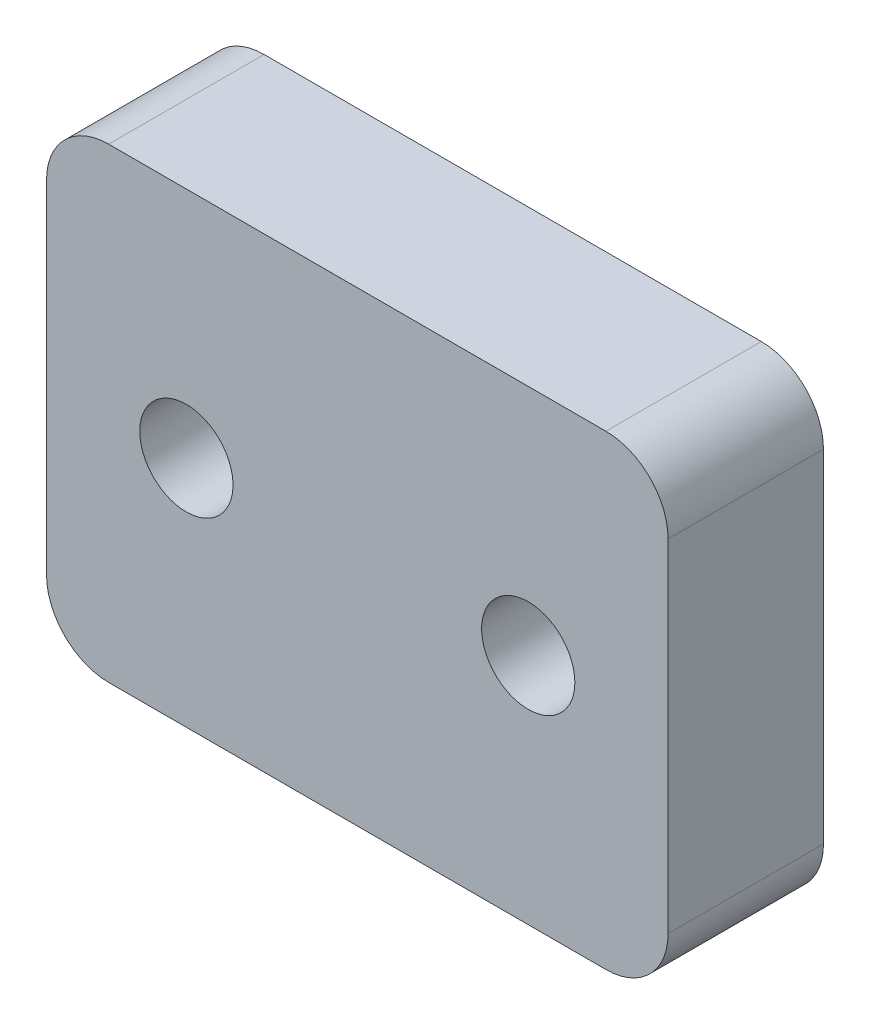
ISO-10303-21;
HEADER;
FILE_DESCRIPTION(('STEP AP214'),'2;1');
FILE_NAME('part.step','',(''),(''),'','','');
FILE_SCHEMA(('AUTOMOTIVE_DESIGN { 1 0 10303 214 1 1 1 1 }'));
ENDSEC;
DATA;
#1=APPLICATION_CONTEXT('core data for automotive mechanical design processes');
#2=APPLICATION_PROTOCOL_DEFINITION('international standard','automotive_design',2000,#1);
#3=PRODUCT_CONTEXT('',#1,'mechanical');
#4=PRODUCT('Part','Part','',(#3));
#5=PRODUCT_RELATED_PRODUCT_CATEGORY('part','',(#4));
#6=PRODUCT_DEFINITION_FORMATION('','',#4);
#7=PRODUCT_DEFINITION_CONTEXT('part definition',#1,'design');
#8=PRODUCT_DEFINITION('design','',#6,#7);
#9=PRODUCT_DEFINITION_SHAPE('','',#8);
#10=(LENGTH_UNIT() NAMED_UNIT(*) SI_UNIT(.MILLI.,.METRE.));
#11=(NAMED_UNIT(*) PLANE_ANGLE_UNIT() SI_UNIT($,.RADIAN.));
#12=(NAMED_UNIT(*) SI_UNIT($,.STERADIAN.) SOLID_ANGLE_UNIT());
#13=UNCERTAINTY_MEASURE_WITH_UNIT(LENGTH_MEASURE(1.E-05),#10,'distance_accuracy_value','');
#14=(GEOMETRIC_REPRESENTATION_CONTEXT(3) GLOBAL_UNCERTAINTY_ASSIGNED_CONTEXT((#13)) GLOBAL_UNIT_ASSIGNED_CONTEXT((#10,
#11,#12)) REPRESENTATION_CONTEXT('',''));
#15=CARTESIAN_POINT('',(0.,0.,0.));
#16=DIRECTION('',(0.,0.,1.));
#17=DIRECTION('',(1.,0.,0.));
#18=AXIS2_PLACEMENT_3D('',#15,#16,#17);
#19=CARTESIAN_POINT('',(-10.,-7.5,5.));
#20=DIRECTION('',(1.,0.,0.));
#21=DIRECTION('',(0.,0.,-1.));
#22=AXIS2_PLACEMENT_3D('',#19,#20,#21);
#23=PLANE('',#22);
#24=DIRECTION('',(0.,-1.,0.));
#25=VECTOR('',#24,1.);
#26=CARTESIAN_POINT('',(-10.,-7.5,5.));
#27=LINE('',#26,#25);
#28=CARTESIAN_POINT('',(-10.,5.5,5.));
#29=VERTEX_POINT('',#28);
#30=CARTESIAN_POINT('',(-10.,-5.5,5.));
#31=VERTEX_POINT('',#30);
#32=EDGE_CURVE('E144',#29,#31,#27,.T.);
#33=ORIENTED_EDGE('',*,*,#32,.F.);
#34=DIRECTION('',(0.,0.,-1.));
#35=VECTOR('',#34,1.);
#36=CARTESIAN_POINT('',(-10.,5.5,5.));
#37=LINE('',#36,#35);
#38=CARTESIAN_POINT('',(-10.,5.5,0.));
#39=VERTEX_POINT('',#38);
#40=EDGE_CURVE('E11',#29,#39,#37,.T.);
#41=ORIENTED_EDGE('',*,*,#40,.T.);
#42=DIRECTION('',(0.,-1.,0.));
#43=VECTOR('',#42,1.);
#44=CARTESIAN_POINT('',(-10.,-7.5,0.));
#45=LINE('',#44,#43);
#46=CARTESIAN_POINT('',(-10.,-5.5,0.));
#47=VERTEX_POINT('',#46);
#48=EDGE_CURVE('E146',#39,#47,#45,.T.);
#49=ORIENTED_EDGE('',*,*,#48,.T.);
#50=DIRECTION('',(0.,0.,-1.));
#51=VECTOR('',#50,1.);
#52=CARTESIAN_POINT('',(-10.,-5.5,5.));
#53=LINE('',#52,#51);
#54=EDGE_CURVE('E52',#47,#31,#53,.F.);
#55=ORIENTED_EDGE('',*,*,#54,.T.);
#56=EDGE_LOOP('',(#33,#41,#49,#55));
#57=FACE_BOUND('',#56,.T.);
#58=ADVANCED_FACE('F43',(#57),#23,.F.);
#59=CARTESIAN_POINT('',(10.,-7.5,5.));
#60=DIRECTION('',(0.,1.,0.));
#61=DIRECTION('',(-1.,0.,0.));
#62=AXIS2_PLACEMENT_3D('',#59,#60,#61);
#63=PLANE('',#62);
#64=DIRECTION('',(1.,0.,0.));
#65=VECTOR('',#64,1.);
#66=CARTESIAN_POINT('',(10.,-7.5,0.));
#67=LINE('',#66,#65);
#68=CARTESIAN_POINT('',(-8.,-7.5,0.));
#69=VERTEX_POINT('',#68);
#70=CARTESIAN_POINT('',(8.,-7.5,0.));
#71=VERTEX_POINT('',#70);
#72=EDGE_CURVE('E140',#69,#71,#67,.T.);
#73=ORIENTED_EDGE('',*,*,#72,.T.);
#74=DIRECTION('',(0.,0.,-1.));
#75=VECTOR('',#74,1.);
#76=CARTESIAN_POINT('',(8.,-7.5,5.));
#77=LINE('',#76,#75);
#78=CARTESIAN_POINT('',(8.,-7.5,5.));
#79=VERTEX_POINT('',#78);
#80=EDGE_CURVE('E116',#71,#79,#77,.F.);
#81=ORIENTED_EDGE('',*,*,#80,.T.);
#82=DIRECTION('',(1.,0.,0.));
#83=VECTOR('',#82,1.);
#84=CARTESIAN_POINT('',(10.,-7.5,5.));
#85=LINE('',#84,#83);
#86=CARTESIAN_POINT('',(-8.,-7.5,5.));
#87=VERTEX_POINT('',#86);
#88=EDGE_CURVE('E196',#87,#79,#85,.T.);
#89=ORIENTED_EDGE('',*,*,#88,.F.);
#90=DIRECTION('',(0.,0.,-1.));
#91=VECTOR('',#90,1.);
#92=CARTESIAN_POINT('',(-8.,-7.5,5.));
#93=LINE('',#92,#91);
#94=EDGE_CURVE('E122',#87,#69,#93,.T.);
#95=ORIENTED_EDGE('',*,*,#94,.T.);
#96=EDGE_LOOP('',(#73,#81,#89,#95));
#97=FACE_BOUND('',#96,.T.);
#98=ADVANCED_FACE('F200',(#97),#63,.F.);
#99=CARTESIAN_POINT('',(10.,-7.5,5.));
#100=DIRECTION('',(-1.,0.,0.));
#101=DIRECTION('',(0.,0.,1.));
#102=AXIS2_PLACEMENT_3D('',#99,#100,#101);
#103=PLANE('',#102);
#104=DIRECTION('',(0.,1.,0.));
#105=VECTOR('',#104,1.);
#106=CARTESIAN_POINT('',(10.,-7.5,5.));
#107=LINE('',#106,#105);
#108=CARTESIAN_POINT('',(10.,-5.5,5.));
#109=VERTEX_POINT('',#108);
#110=CARTESIAN_POINT('',(10.,5.5,5.));
#111=VERTEX_POINT('',#110);
#112=EDGE_CURVE('E131',#109,#111,#107,.T.);
#113=ORIENTED_EDGE('',*,*,#112,.F.);
#114=DIRECTION('',(0.,0.,-1.));
#115=VECTOR('',#114,1.);
#116=CARTESIAN_POINT('',(10.,-5.5,5.));
#117=LINE('',#116,#115);
#118=CARTESIAN_POINT('',(10.,-5.5,0.));
#119=VERTEX_POINT('',#118);
#120=EDGE_CURVE('E115',#109,#119,#117,.T.);
#121=ORIENTED_EDGE('',*,*,#120,.T.);
#122=DIRECTION('',(0.,1.,0.));
#123=VECTOR('',#122,1.);
#124=CARTESIAN_POINT('',(10.,-7.5,0.));
#125=LINE('',#124,#123);
#126=CARTESIAN_POINT('',(10.,5.5,0.));
#127=VERTEX_POINT('',#126);
#128=EDGE_CURVE('E129',#119,#127,#125,.T.);
#129=ORIENTED_EDGE('',*,*,#128,.T.);
#130=DIRECTION('',(0.,0.,-1.));
#131=VECTOR('',#130,1.);
#132=CARTESIAN_POINT('',(10.,5.5,5.));
#133=LINE('',#132,#131);
#134=EDGE_CURVE('E134',#127,#111,#133,.F.);
#135=ORIENTED_EDGE('',*,*,#134,.T.);
#136=EDGE_LOOP('',(#113,#121,#129,#135));
#137=FACE_BOUND('',#136,.T.);
#138=ADVANCED_FACE('F128',(#137),#103,.F.);
#139=CARTESIAN_POINT('',(10.,7.5,5.));
#140=DIRECTION('',(0.,-1.,0.));
#141=DIRECTION('',(1.,0.,0.));
#142=AXIS2_PLACEMENT_3D('',#139,#140,#141);
#143=PLANE('',#142);
#144=DIRECTION('',(-1.,0.,0.));
#145=VECTOR('',#144,1.);
#146=CARTESIAN_POINT('',(10.,7.5,5.));
#147=LINE('',#146,#145);
#148=CARTESIAN_POINT('',(8.,7.5,5.));
#149=VERTEX_POINT('',#148);
#150=CARTESIAN_POINT('',(-8.,7.5,5.));
#151=VERTEX_POINT('',#150);
#152=EDGE_CURVE('E151',#149,#151,#147,.T.);
#153=ORIENTED_EDGE('',*,*,#152,.F.);
#154=DIRECTION('',(0.,0.,-1.));
#155=VECTOR('',#154,1.);
#156=CARTESIAN_POINT('',(8.,7.5,5.));
#157=LINE('',#156,#155);
#158=CARTESIAN_POINT('',(8.,7.5,0.));
#159=VERTEX_POINT('',#158);
#160=EDGE_CURVE('E178',#149,#159,#157,.T.);
#161=ORIENTED_EDGE('',*,*,#160,.T.);
#162=DIRECTION('',(-1.,0.,0.));
#163=VECTOR('',#162,1.);
#164=CARTESIAN_POINT('',(10.,7.5,0.));
#165=LINE('',#164,#163);
#166=CARTESIAN_POINT('',(-8.,7.5,0.));
#167=VERTEX_POINT('',#166);
#168=EDGE_CURVE('E139',#159,#167,#165,.T.);
#169=ORIENTED_EDGE('',*,*,#168,.T.);
#170=DIRECTION('',(0.,0.,-1.));
#171=VECTOR('',#170,1.);
#172=CARTESIAN_POINT('',(-8.,7.5,5.));
#173=LINE('',#172,#171);
#174=EDGE_CURVE('E59',#167,#151,#173,.F.);
#175=ORIENTED_EDGE('',*,*,#174,.T.);
#176=EDGE_LOOP('',(#153,#161,#169,#175));
#177=FACE_BOUND('',#176,.T.);
#178=ADVANCED_FACE('F230',(#177),#143,.F.);
#179=CARTESIAN_POINT('',(0.,0.,5.));
#180=DIRECTION('',(0.,0.,1.));
#181=DIRECTION('',(1.,0.,0.));
#182=AXIS2_PLACEMENT_3D('',#179,#180,#181);
#183=PLANE('',#182);
#184=CARTESIAN_POINT('',(5.5,0.,5.));
#185=DIRECTION('',(0.,0.,1.));
#186=DIRECTION('',(1.,0.,0.));
#187=AXIS2_PLACEMENT_3D('',#184,#185,#186);
#188=CIRCLE('',#187,1.5);
#189=CARTESIAN_POINT('',(7.,0.,5.));
#190=VERTEX_POINT('',#189);
#191=EDGE_CURVE('E205',#190,#190,#188,.T.);
#192=ORIENTED_EDGE('',*,*,#191,.F.);
#193=EDGE_LOOP('',(#192));
#194=FACE_BOUND('',#193,.T.);
#195=CARTESIAN_POINT('',(-5.5,0.,5.));
#196=DIRECTION('',(0.,0.,1.));
#197=DIRECTION('',(-1.,0.,0.));
#198=AXIS2_PLACEMENT_3D('',#195,#196,#197);
#199=CIRCLE('',#198,1.5);
#200=CARTESIAN_POINT('',(-7.,0.,5.));
#201=VERTEX_POINT('',#200);
#202=EDGE_CURVE('E218',#201,#201,#199,.T.);
#203=ORIENTED_EDGE('',*,*,#202,.F.);
#204=EDGE_LOOP('',(#203));
#205=FACE_BOUND('',#204,.T.);
#206=ORIENTED_EDGE('',*,*,#88,.T.);
#207=CARTESIAN_POINT('',(8.,-5.5,5.));
#208=DIRECTION('',(0.,0.,1.));
#209=DIRECTION('',(1.,0.,0.));
#210=AXIS2_PLACEMENT_3D('',#207,#208,#209);
#211=CIRCLE('',#210,2.);
#212=EDGE_CURVE('E173',#79,#109,#211,.T.);
#213=ORIENTED_EDGE('',*,*,#212,.T.);
#214=ORIENTED_EDGE('',*,*,#112,.T.);
#215=CARTESIAN_POINT('',(8.,5.5,5.));
#216=DIRECTION('',(0.,0.,1.));
#217=DIRECTION('',(1.,0.,0.));
#218=AXIS2_PLACEMENT_3D('',#215,#216,#217);
#219=CIRCLE('',#218,2.);
#220=EDGE_CURVE('E66',#111,#149,#219,.T.);
#221=ORIENTED_EDGE('',*,*,#220,.T.);
#222=ORIENTED_EDGE('',*,*,#152,.T.);
#223=CARTESIAN_POINT('',(-8.,5.5,5.));
#224=DIRECTION('',(0.,0.,1.));
#225=DIRECTION('',(1.,0.,0.));
#226=AXIS2_PLACEMENT_3D('',#223,#224,#225);
#227=CIRCLE('',#226,2.);
#228=EDGE_CURVE('E168',#151,#29,#227,.T.);
#229=ORIENTED_EDGE('',*,*,#228,.T.);
#230=ORIENTED_EDGE('',*,*,#32,.T.);
#231=CARTESIAN_POINT('',(-8.,-5.5,5.));
#232=DIRECTION('',(0.,0.,1.));
#233=DIRECTION('',(1.,0.,0.));
#234=AXIS2_PLACEMENT_3D('',#231,#232,#233);
#235=CIRCLE('',#234,2.);
#236=EDGE_CURVE('E165',#31,#87,#235,.T.);
#237=ORIENTED_EDGE('',*,*,#236,.T.);
#238=EDGE_LOOP('',(#206,#213,#214,#221,#222,#229,#230,#237));
#239=FACE_BOUND('',#238,.T.);
#240=ADVANCED_FACE('F192',(#194,#205,#239),#183,.T.);
#241=CARTESIAN_POINT('',(0.,0.,0.));
#242=DIRECTION('',(0.,0.,1.));
#243=DIRECTION('',(1.,0.,0.));
#244=AXIS2_PLACEMENT_3D('',#241,#242,#243);
#245=PLANE('',#244);
#246=CARTESIAN_POINT('',(5.5,0.,0.));
#247=DIRECTION('',(0.,0.,1.));
#248=DIRECTION('',(1.,0.,0.));
#249=AXIS2_PLACEMENT_3D('',#246,#247,#248);
#250=CIRCLE('',#249,1.5);
#251=CARTESIAN_POINT('',(7.,0.,0.));
#252=VERTEX_POINT('',#251);
#253=EDGE_CURVE('E202',#252,#252,#250,.T.);
#254=ORIENTED_EDGE('',*,*,#253,.T.);
#255=EDGE_LOOP('',(#254));
#256=FACE_BOUND('',#255,.T.);
#257=CARTESIAN_POINT('',(-5.5,0.,0.));
#258=DIRECTION('',(0.,0.,1.));
#259=DIRECTION('',(-1.,0.,0.));
#260=AXIS2_PLACEMENT_3D('',#257,#258,#259);
#261=CIRCLE('',#260,1.5);
#262=CARTESIAN_POINT('',(-7.,0.,0.));
#263=VERTEX_POINT('',#262);
#264=EDGE_CURVE('E214',#263,#263,#261,.T.);
#265=ORIENTED_EDGE('',*,*,#264,.T.);
#266=EDGE_LOOP('',(#265));
#267=FACE_BOUND('',#266,.T.);
#268=ORIENTED_EDGE('',*,*,#128,.F.);
#269=CARTESIAN_POINT('',(8.,-5.5,0.));
#270=DIRECTION('',(0.,0.,1.));
#271=DIRECTION('',(1.,0.,0.));
#272=AXIS2_PLACEMENT_3D('',#269,#270,#271);
#273=CIRCLE('',#272,2.);
#274=EDGE_CURVE('E111',#119,#71,#273,.F.);
#275=ORIENTED_EDGE('',*,*,#274,.T.);
#276=ORIENTED_EDGE('',*,*,#72,.F.);
#277=CARTESIAN_POINT('',(-8.,-5.5,0.));
#278=DIRECTION('',(0.,0.,1.));
#279=DIRECTION('',(1.,0.,0.));
#280=AXIS2_PLACEMENT_3D('',#277,#278,#279);
#281=CIRCLE('',#280,2.);
#282=EDGE_CURVE('E133',#69,#47,#281,.F.);
#283=ORIENTED_EDGE('',*,*,#282,.T.);
#284=ORIENTED_EDGE('',*,*,#48,.F.);
#285=CARTESIAN_POINT('',(-8.,5.5,0.));
#286=DIRECTION('',(0.,0.,1.));
#287=DIRECTION('',(1.,0.,0.));
#288=AXIS2_PLACEMENT_3D('',#285,#286,#287);
#289=CIRCLE('',#288,2.);
#290=EDGE_CURVE('E155',#39,#167,#289,.F.);
#291=ORIENTED_EDGE('',*,*,#290,.T.);
#292=ORIENTED_EDGE('',*,*,#168,.F.);
#293=CARTESIAN_POINT('',(8.,5.5,0.));
#294=DIRECTION('',(0.,0.,1.));
#295=DIRECTION('',(1.,0.,0.));
#296=AXIS2_PLACEMENT_3D('',#293,#294,#295);
#297=CIRCLE('',#296,2.);
#298=EDGE_CURVE('E123',#159,#127,#297,.F.);
#299=ORIENTED_EDGE('',*,*,#298,.T.);
#300=EDGE_LOOP('',(#268,#275,#276,#283,#284,#291,#292,#299));
#301=FACE_BOUND('',#300,.T.);
#302=ADVANCED_FACE('F136',(#256,#267,#301),#245,.F.);
#303=CARTESIAN_POINT('',(-5.5,0.,0.));
#304=DIRECTION('',(0.,0.,1.));
#305=DIRECTION('',(1.,0.,0.));
#306=AXIS2_PLACEMENT_3D('',#303,#304,#305);
#307=CYLINDRICAL_SURFACE('',#306,1.5);
#308=ORIENTED_EDGE('',*,*,#264,.F.);
#309=EDGE_LOOP('',(#308));
#310=FACE_BOUND('',#309,.T.);
#311=ORIENTED_EDGE('',*,*,#202,.T.);
#312=EDGE_LOOP('',(#311));
#313=FACE_BOUND('',#312,.T.);
#314=ADVANCED_FACE('F234',(#310,#313),#307,.F.);
#315=CARTESIAN_POINT('',(5.5,0.,0.));
#316=DIRECTION('',(0.,0.,1.));
#317=DIRECTION('',(1.,0.,0.));
#318=AXIS2_PLACEMENT_3D('',#315,#316,#317);
#319=CYLINDRICAL_SURFACE('',#318,1.5);
#320=ORIENTED_EDGE('',*,*,#253,.F.);
#321=EDGE_LOOP('',(#320));
#322=FACE_BOUND('',#321,.T.);
#323=ORIENTED_EDGE('',*,*,#191,.T.);
#324=EDGE_LOOP('',(#323));
#325=FACE_BOUND('',#324,.T.);
#326=ADVANCED_FACE('F226',(#322,#325),#319,.F.);
#327=CARTESIAN_POINT('',(8.,-5.5,5.));
#328=DIRECTION('',(0.,0.,-1.));
#329=DIRECTION('',(-1.,0.,0.));
#330=AXIS2_PLACEMENT_3D('',#327,#328,#329);
#331=CYLINDRICAL_SURFACE('',#330,2.);
#332=ORIENTED_EDGE('',*,*,#212,.F.);
#333=ORIENTED_EDGE('',*,*,#80,.F.);
#334=ORIENTED_EDGE('',*,*,#274,.F.);
#335=ORIENTED_EDGE('',*,*,#120,.F.);
#336=EDGE_LOOP('',(#332,#333,#334,#335));
#337=FACE_BOUND('',#336,.T.);
#338=ADVANCED_FACE('F114',(#337),#331,.T.);
#339=CARTESIAN_POINT('',(8.,5.5,5.));
#340=DIRECTION('',(0.,0.,-1.));
#341=DIRECTION('',(-1.,0.,0.));
#342=AXIS2_PLACEMENT_3D('',#339,#340,#341);
#343=CYLINDRICAL_SURFACE('',#342,2.);
#344=ORIENTED_EDGE('',*,*,#220,.F.);
#345=ORIENTED_EDGE('',*,*,#134,.F.);
#346=ORIENTED_EDGE('',*,*,#298,.F.);
#347=ORIENTED_EDGE('',*,*,#160,.F.);
#348=EDGE_LOOP('',(#344,#345,#346,#347));
#349=FACE_BOUND('',#348,.T.);
#350=ADVANCED_FACE('F257',(#349),#343,.T.);
#351=CARTESIAN_POINT('',(-8.,5.5,5.));
#352=DIRECTION('',(0.,0.,-1.));
#353=DIRECTION('',(-1.,0.,0.));
#354=AXIS2_PLACEMENT_3D('',#351,#352,#353);
#355=CYLINDRICAL_SURFACE('',#354,2.);
#356=ORIENTED_EDGE('',*,*,#228,.F.);
#357=ORIENTED_EDGE('',*,*,#174,.F.);
#358=ORIENTED_EDGE('',*,*,#290,.F.);
#359=ORIENTED_EDGE('',*,*,#40,.F.);
#360=EDGE_LOOP('',(#356,#357,#358,#359));
#361=FACE_BOUND('',#360,.T.);
#362=ADVANCED_FACE('F259',(#361),#355,.T.);
#363=CARTESIAN_POINT('',(-8.,-5.5,5.));
#364=DIRECTION('',(0.,0.,-1.));
#365=DIRECTION('',(-1.,0.,0.));
#366=AXIS2_PLACEMENT_3D('',#363,#364,#365);
#367=CYLINDRICAL_SURFACE('',#366,2.);
#368=ORIENTED_EDGE('',*,*,#236,.F.);
#369=ORIENTED_EDGE('',*,*,#54,.F.);
#370=ORIENTED_EDGE('',*,*,#282,.F.);
#371=ORIENTED_EDGE('',*,*,#94,.F.);
#372=EDGE_LOOP('',(#368,#369,#370,#371));
#373=FACE_BOUND('',#372,.T.);
#374=ADVANCED_FACE('F45',(#373),#367,.T.);
#375=CLOSED_SHELL('',(#58,#98,#138,#178,#240,#302,#314,#326,#338,#350,#362,#374));
#376=MANIFOLD_SOLID_BREP('B2',#375);
#377=ADVANCED_BREP_SHAPE_REPRESENTATION('',(#18,#376),#14);
#378=SHAPE_DEFINITION_REPRESENTATION(#9,#377);
ENDSEC;
END-ISO-10303-21;
